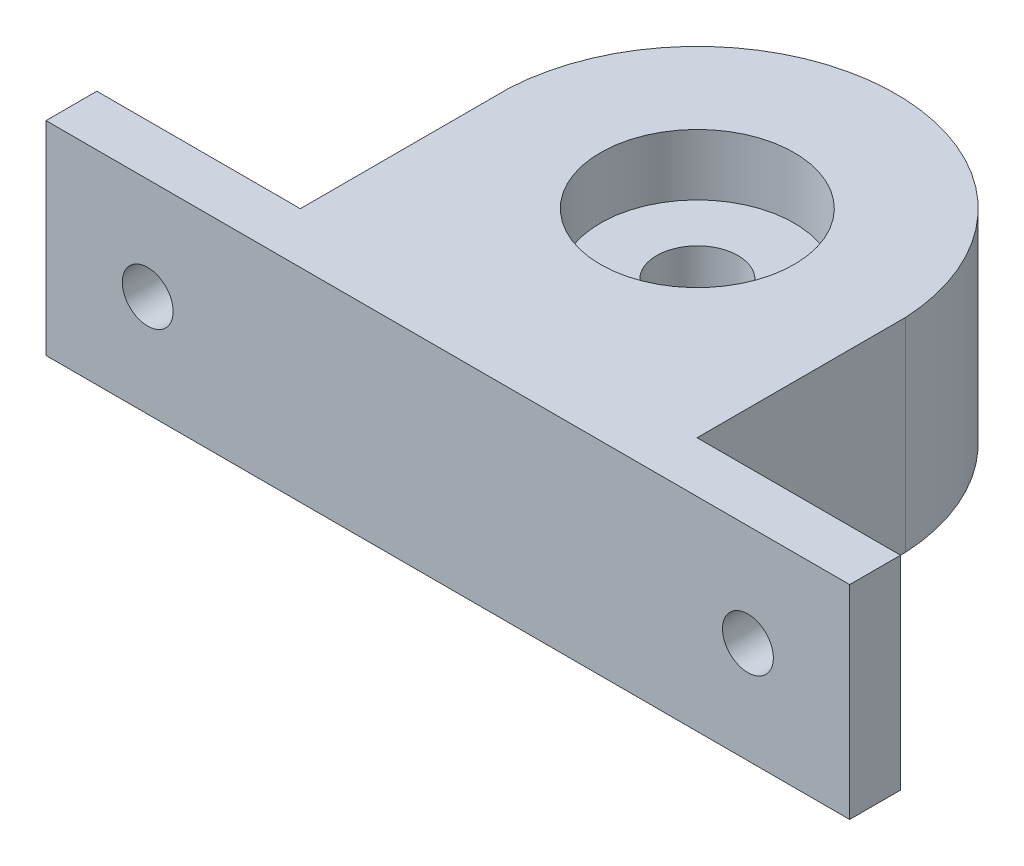
ISO-10303-21;
HEADER;
FILE_DESCRIPTION(('STEP AP214'),'2;1');
FILE_NAME('part.step','',(''),(''),'','','');
FILE_SCHEMA(('AUTOMOTIVE_DESIGN { 1 0 10303 214 1 1 1 1 }'));
ENDSEC;
DATA;
#1=APPLICATION_CONTEXT('core data for automotive mechanical design processes');
#2=APPLICATION_PROTOCOL_DEFINITION('international standard','automotive_design',2000,#1);
#3=PRODUCT_CONTEXT('',#1,'mechanical');
#4=PRODUCT('Part','Part','',(#3));
#5=PRODUCT_RELATED_PRODUCT_CATEGORY('part','',(#4));
#6=PRODUCT_DEFINITION_FORMATION('','',#4);
#7=PRODUCT_DEFINITION_CONTEXT('part definition',#1,'design');
#8=PRODUCT_DEFINITION('design','',#6,#7);
#9=PRODUCT_DEFINITION_SHAPE('','',#8);
#10=(LENGTH_UNIT() NAMED_UNIT(*) SI_UNIT(.MILLI.,.METRE.));
#11=(NAMED_UNIT(*) PLANE_ANGLE_UNIT() SI_UNIT($,.RADIAN.));
#12=(NAMED_UNIT(*) SI_UNIT($,.STERADIAN.) SOLID_ANGLE_UNIT());
#13=UNCERTAINTY_MEASURE_WITH_UNIT(LENGTH_MEASURE(1.E-05),#10,'distance_accuracy_value','');
#14=(GEOMETRIC_REPRESENTATION_CONTEXT(3) GLOBAL_UNCERTAINTY_ASSIGNED_CONTEXT((#13)) GLOBAL_UNIT_ASSIGNED_CONTEXT((#10,
#11,#12)) REPRESENTATION_CONTEXT('',''));
#15=CARTESIAN_POINT('',(0.,0.,0.));
#16=DIRECTION('',(0.,0.,1.));
#17=DIRECTION('',(1.,0.,0.));
#18=AXIS2_PLACEMENT_3D('',#15,#16,#17);
#19=CARTESIAN_POINT('',(16.5,-20.,0.));
#20=DIRECTION('',(-1.,0.,0.));
#21=DIRECTION('',(0.,0.,1.));
#22=AXIS2_PLACEMENT_3D('',#19,#20,#21);
#23=PLANE('',#22);
#24=DIRECTION('',(0.,0.,1.));
#25=VECTOR('',#24,1.);
#26=CARTESIAN_POINT('',(16.5,0.,0.));
#27=LINE('',#26,#25);
#28=CARTESIAN_POINT('',(16.5,0.,-23.0127373132569));
#29=VERTEX_POINT('',#28);
#30=CARTESIAN_POINT('',(16.5,0.,-2.5));
#31=VERTEX_POINT('',#30);
#32=EDGE_CURVE('E151',#29,#31,#27,.T.);
#33=ORIENTED_EDGE('',*,*,#32,.T.);
#34=DIRECTION('',(0.,1.,0.));
#35=VECTOR('',#34,1.);
#36=CARTESIAN_POINT('',(16.5,-20.,-2.5));
#37=LINE('',#36,#35);
#38=CARTESIAN_POINT('',(16.5,-20.,-2.5));
#39=VERTEX_POINT('',#38);
#40=EDGE_CURVE('E12',#39,#31,#37,.T.);
#41=ORIENTED_EDGE('',*,*,#40,.F.);
#42=DIRECTION('',(0.,0.,1.));
#43=VECTOR('',#42,1.);
#44=CARTESIAN_POINT('',(16.5,-20.,0.));
#45=LINE('',#44,#43);
#46=CARTESIAN_POINT('',(16.5,-20.,-23.0127373132569));
#47=VERTEX_POINT('',#46);
#48=EDGE_CURVE('E177',#47,#39,#45,.T.);
#49=ORIENTED_EDGE('',*,*,#48,.F.);
#50=DIRECTION('',(0.,1.,0.));
#51=VECTOR('',#50,1.);
#52=CARTESIAN_POINT('',(16.5,-20.,-23.0127373132569));
#53=LINE('',#52,#51);
#54=EDGE_CURVE('E47',#47,#29,#53,.T.);
#55=ORIENTED_EDGE('',*,*,#54,.T.);
#56=EDGE_LOOP('',(#33,#41,#49,#55));
#57=FACE_BOUND('',#56,.T.);
#58=ADVANCED_FACE('F43',(#57),#23,.F.);
#59=CARTESIAN_POINT('',(0.,-20.,-2.5));
#60=DIRECTION('',(0.,0.,1.));
#61=DIRECTION('',(1.,0.,0.));
#62=AXIS2_PLACEMENT_3D('',#59,#60,#61);
#63=PLANE('',#62);
#64=CARTESIAN_POINT('',(26.5,-10.,-2.5));
#65=DIRECTION('',(0.,0.,-1.));
#66=DIRECTION('',(-1.,0.,0.));
#67=AXIS2_PLACEMENT_3D('',#64,#65,#66);
#68=CIRCLE('',#67,2.5);
#69=CARTESIAN_POINT('',(24.,-10.,-2.5));
#70=VERTEX_POINT('',#69);
#71=EDGE_CURVE('E258',#70,#70,#68,.T.);
#72=ORIENTED_EDGE('',*,*,#71,.F.);
#73=EDGE_LOOP('',(#72));
#74=FACE_BOUND('',#73,.T.);
#75=DIRECTION('',(1.,0.,0.));
#76=VECTOR('',#75,1.);
#77=CARTESIAN_POINT('',(0.,0.,-2.5));
#78=LINE('',#77,#76);
#79=CARTESIAN_POINT('',(36.5,0.,-2.5));
#80=VERTEX_POINT('',#79);
#81=EDGE_CURVE('E96',#31,#80,#78,.T.);
#82=ORIENTED_EDGE('',*,*,#81,.T.);
#83=DIRECTION('',(0.,1.,0.));
#84=VECTOR('',#83,1.);
#85=CARTESIAN_POINT('',(36.5,-20.,-2.5));
#86=LINE('',#85,#84);
#87=CARTESIAN_POINT('',(36.5,-20.,-2.5));
#88=VERTEX_POINT('',#87);
#89=EDGE_CURVE('E54',#88,#80,#86,.T.);
#90=ORIENTED_EDGE('',*,*,#89,.F.);
#91=DIRECTION('',(1.,0.,0.));
#92=VECTOR('',#91,1.);
#93=CARTESIAN_POINT('',(0.,-20.,-2.5));
#94=LINE('',#93,#92);
#95=EDGE_CURVE('E62',#39,#88,#94,.T.);
#96=ORIENTED_EDGE('',*,*,#95,.F.);
#97=ORIENTED_EDGE('',*,*,#40,.T.);
#98=EDGE_LOOP('',(#82,#90,#96,#97));
#99=FACE_BOUND('',#98,.T.);
#100=ADVANCED_FACE('F209',(#74,#99),#63,.F.);
#101=CARTESIAN_POINT('',(36.5,-20.,0.));
#102=DIRECTION('',(1.,0.,0.));
#103=DIRECTION('',(0.,0.,-1.));
#104=AXIS2_PLACEMENT_3D('',#101,#102,#103);
#105=PLANE('',#104);
#106=DIRECTION('',(0.,0.,-1.));
#107=VECTOR('',#106,1.);
#108=CARTESIAN_POINT('',(36.5,0.,0.));
#109=LINE('',#108,#107);
#110=CARTESIAN_POINT('',(36.5,0.,2.5));
#111=VERTEX_POINT('',#110);
#112=EDGE_CURVE('E120',#111,#80,#109,.T.);
#113=ORIENTED_EDGE('',*,*,#112,.F.);
#114=DIRECTION('',(0.,1.,0.));
#115=VECTOR('',#114,1.);
#116=CARTESIAN_POINT('',(36.5,-20.,2.5));
#117=LINE('',#116,#115);
#118=CARTESIAN_POINT('',(36.5,-20.,2.5));
#119=VERTEX_POINT('',#118);
#120=EDGE_CURVE('E116',#119,#111,#117,.T.);
#121=ORIENTED_EDGE('',*,*,#120,.F.);
#122=DIRECTION('',(0.,0.,-1.));
#123=VECTOR('',#122,1.);
#124=CARTESIAN_POINT('',(36.5,-20.,0.));
#125=LINE('',#124,#123);
#126=EDGE_CURVE('E119',#119,#88,#125,.T.);
#127=ORIENTED_EDGE('',*,*,#126,.T.);
#128=ORIENTED_EDGE('',*,*,#89,.T.);
#129=EDGE_LOOP('',(#113,#121,#127,#128));
#130=FACE_BOUND('',#129,.T.);
#131=ADVANCED_FACE('F118',(#130),#105,.T.);
#132=CARTESIAN_POINT('',(0.,-20.,2.5));
#133=DIRECTION('',(0.,0.,1.));
#134=DIRECTION('',(1.,0.,0.));
#135=AXIS2_PLACEMENT_3D('',#132,#133,#134);
#136=PLANE('',#135);
#137=CARTESIAN_POINT('',(26.5,-10.,2.5));
#138=DIRECTION('',(0.,0.,1.));
#139=DIRECTION('',(1.,0.,0.));
#140=AXIS2_PLACEMENT_3D('',#137,#138,#139);
#141=CIRCLE('',#140,2.5);
#142=CARTESIAN_POINT('',(29.,-10.,2.5));
#143=VERTEX_POINT('',#142);
#144=EDGE_CURVE('E152',#143,#143,#141,.F.);
#145=ORIENTED_EDGE('',*,*,#144,.T.);
#146=EDGE_LOOP('',(#145));
#147=FACE_BOUND('',#146,.T.);
#148=CARTESIAN_POINT('',(-32.5,-10.,2.5));
#149=DIRECTION('',(0.,0.,1.));
#150=DIRECTION('',(1.,0.,0.));
#151=AXIS2_PLACEMENT_3D('',#148,#149,#150);
#152=CIRCLE('',#151,2.5);
#153=CARTESIAN_POINT('',(-30.,-10.,2.5));
#154=VERTEX_POINT('',#153);
#155=EDGE_CURVE('E254',#154,#154,#152,.F.);
#156=ORIENTED_EDGE('',*,*,#155,.T.);
#157=EDGE_LOOP('',(#156));
#158=FACE_BOUND('',#157,.T.);
#159=DIRECTION('',(1.,0.,0.));
#160=VECTOR('',#159,1.);
#161=CARTESIAN_POINT('',(0.,0.,2.5));
#162=LINE('',#161,#160);
#163=CARTESIAN_POINT('',(-42.5,0.,2.5));
#164=VERTEX_POINT('',#163);
#165=EDGE_CURVE('E171',#164,#111,#162,.T.);
#166=ORIENTED_EDGE('',*,*,#165,.F.);
#167=DIRECTION('',(0.,1.,0.));
#168=VECTOR('',#167,1.);
#169=CARTESIAN_POINT('',(-42.5,-20.,2.5));
#170=LINE('',#169,#168);
#171=CARTESIAN_POINT('',(-42.5,-20.,2.5));
#172=VERTEX_POINT('',#171);
#173=EDGE_CURVE('E126',#172,#164,#170,.T.);
#174=ORIENTED_EDGE('',*,*,#173,.F.);
#175=DIRECTION('',(1.,0.,0.));
#176=VECTOR('',#175,1.);
#177=CARTESIAN_POINT('',(0.,-20.,2.5));
#178=LINE('',#177,#176);
#179=EDGE_CURVE('E132',#172,#119,#178,.T.);
#180=ORIENTED_EDGE('',*,*,#179,.T.);
#181=ORIENTED_EDGE('',*,*,#120,.T.);
#182=EDGE_LOOP('',(#166,#174,#180,#181));
#183=FACE_BOUND('',#182,.T.);
#184=ADVANCED_FACE('F135',(#147,#158,#183),#136,.T.);
#185=CARTESIAN_POINT('',(-42.5,-20.,0.));
#186=DIRECTION('',(1.,0.,0.));
#187=DIRECTION('',(0.,0.,-1.));
#188=AXIS2_PLACEMENT_3D('',#185,#186,#187);
#189=PLANE('',#188);
#190=DIRECTION('',(0.,0.,-1.));
#191=VECTOR('',#190,1.);
#192=CARTESIAN_POINT('',(-42.5,0.,0.));
#193=LINE('',#192,#191);
#194=CARTESIAN_POINT('',(-42.5,0.,-2.5));
#195=VERTEX_POINT('',#194);
#196=EDGE_CURVE('E168',#164,#195,#193,.T.);
#197=ORIENTED_EDGE('',*,*,#196,.T.);
#198=DIRECTION('',(0.,1.,0.));
#199=VECTOR('',#198,1.);
#200=CARTESIAN_POINT('',(-42.5,-20.,-2.5));
#201=LINE('',#200,#199);
#202=CARTESIAN_POINT('',(-42.5,-20.,-2.5));
#203=VERTEX_POINT('',#202);
#204=EDGE_CURVE('E183',#203,#195,#201,.T.);
#205=ORIENTED_EDGE('',*,*,#204,.F.);
#206=DIRECTION('',(0.,0.,-1.));
#207=VECTOR('',#206,1.);
#208=CARTESIAN_POINT('',(-42.5,-20.,0.));
#209=LINE('',#208,#207);
#210=EDGE_CURVE('E138',#172,#203,#209,.T.);
#211=ORIENTED_EDGE('',*,*,#210,.F.);
#212=ORIENTED_EDGE('',*,*,#173,.T.);
#213=EDGE_LOOP('',(#197,#205,#211,#212));
#214=FACE_BOUND('',#213,.T.);
#215=ADVANCED_FACE('F224',(#214),#189,.F.);
#216=CARTESIAN_POINT('',(0.,-20.,-2.5));
#217=DIRECTION('',(0.,0.,1.));
#218=DIRECTION('',(1.,0.,0.));
#219=AXIS2_PLACEMENT_3D('',#216,#217,#218);
#220=PLANE('',#219);
#221=CARTESIAN_POINT('',(-32.5,-10.,-2.5));
#222=DIRECTION('',(0.,0.,-1.));
#223=DIRECTION('',(-1.,0.,0.));
#224=AXIS2_PLACEMENT_3D('',#221,#222,#223);
#225=CIRCLE('',#224,2.5);
#226=CARTESIAN_POINT('',(-35.,-10.,-2.5));
#227=VERTEX_POINT('',#226);
#228=EDGE_CURVE('E259',#227,#227,#225,.T.);
#229=ORIENTED_EDGE('',*,*,#228,.F.);
#230=EDGE_LOOP('',(#229));
#231=FACE_BOUND('',#230,.T.);
#232=DIRECTION('',(1.,0.,0.));
#233=VECTOR('',#232,1.);
#234=CARTESIAN_POINT('',(0.,0.,-2.5));
#235=LINE('',#234,#233);
#236=CARTESIAN_POINT('',(-22.5,0.,-2.5));
#237=VERTEX_POINT('',#236);
#238=EDGE_CURVE('E164',#195,#237,#235,.T.);
#239=ORIENTED_EDGE('',*,*,#238,.T.);
#240=DIRECTION('',(0.,1.,0.));
#241=VECTOR('',#240,1.);
#242=CARTESIAN_POINT('',(-22.5,-20.,-2.5));
#243=LINE('',#242,#241);
#244=CARTESIAN_POINT('',(-22.5,-20.,-2.5));
#245=VERTEX_POINT('',#244);
#246=EDGE_CURVE('E187',#245,#237,#243,.T.);
#247=ORIENTED_EDGE('',*,*,#246,.F.);
#248=DIRECTION('',(1.,0.,0.));
#249=VECTOR('',#248,1.);
#250=CARTESIAN_POINT('',(0.,-20.,-2.5));
#251=LINE('',#250,#249);
#252=EDGE_CURVE('E141',#203,#245,#251,.T.);
#253=ORIENTED_EDGE('',*,*,#252,.F.);
#254=ORIENTED_EDGE('',*,*,#204,.T.);
#255=EDGE_LOOP('',(#239,#247,#253,#254));
#256=FACE_BOUND('',#255,.T.);
#257=ADVANCED_FACE('F228',(#231,#256),#220,.F.);
#258=CARTESIAN_POINT('',(-22.5,-20.,0.));
#259=DIRECTION('',(-1.,0.,0.));
#260=DIRECTION('',(0.,0.,1.));
#261=AXIS2_PLACEMENT_3D('',#258,#259,#260);
#262=PLANE('',#261);
#263=DIRECTION('',(0.,0.,1.));
#264=VECTOR('',#263,1.);
#265=CARTESIAN_POINT('',(-22.5,0.,0.));
#266=LINE('',#265,#264);
#267=CARTESIAN_POINT('',(-22.5,0.,-23.0127373132569));
#268=VERTEX_POINT('',#267);
#269=EDGE_CURVE('E160',#268,#237,#266,.T.);
#270=ORIENTED_EDGE('',*,*,#269,.F.);
#271=DIRECTION('',(0.,1.,0.));
#272=VECTOR('',#271,1.);
#273=CARTESIAN_POINT('',(-22.5,-20.,-23.0127373132569));
#274=LINE('',#273,#272);
#275=CARTESIAN_POINT('',(-22.5,-20.,-23.0127373132569));
#276=VERTEX_POINT('',#275);
#277=EDGE_CURVE('E189',#276,#268,#274,.T.);
#278=ORIENTED_EDGE('',*,*,#277,.F.);
#279=DIRECTION('',(0.,0.,1.));
#280=VECTOR('',#279,1.);
#281=CARTESIAN_POINT('',(-22.5,-20.,0.));
#282=LINE('',#281,#280);
#283=EDGE_CURVE('E244',#276,#245,#282,.T.);
#284=ORIENTED_EDGE('',*,*,#283,.T.);
#285=ORIENTED_EDGE('',*,*,#246,.T.);
#286=EDGE_LOOP('',(#270,#278,#284,#285));
#287=FACE_BOUND('',#286,.T.);
#288=ADVANCED_FACE('F205',(#287),#262,.T.);
#289=CARTESIAN_POINT('',(-2.99999999999999,-20.,-22.025));
#290=DIRECTION('',(0.,1.,0.));
#291=DIRECTION('',(0.,0.,1.));
#292=AXIS2_PLACEMENT_3D('',#289,#290,#291);
#293=CYLINDRICAL_SURFACE('',#292,9.525);
#294=CARTESIAN_POINT('',(-2.99999999999999,-6.,-22.025));
#295=DIRECTION('',(0.,1.,0.));
#296=DIRECTION('',(0.,0.,1.));
#297=AXIS2_PLACEMENT_3D('',#294,#295,#296);
#298=CIRCLE('',#297,9.525);
#299=CARTESIAN_POINT('',(-2.99999999999999,-6.,-12.5));
#300=VERTEX_POINT('',#299);
#301=EDGE_CURVE('E270',#300,#300,#298,.F.);
#302=ORIENTED_EDGE('',*,*,#301,.T.);
#303=EDGE_LOOP('',(#302));
#304=FACE_BOUND('',#303,.T.);
#305=CARTESIAN_POINT('',(-2.99999999999999,0.,-22.025));
#306=DIRECTION('',(0.,1.,0.));
#307=DIRECTION('',(0.,0.,1.));
#308=AXIS2_PLACEMENT_3D('',#305,#306,#307);
#309=CIRCLE('',#308,9.525);
#310=CARTESIAN_POINT('',(-2.99999999999999,0.,-12.5));
#311=VERTEX_POINT('',#310);
#312=EDGE_CURVE('E147',#311,#311,#309,.T.);
#313=ORIENTED_EDGE('',*,*,#312,.T.);
#314=EDGE_LOOP('',(#313));
#315=FACE_BOUND('',#314,.T.);
#316=ADVANCED_FACE('F45',(#304,#315),#293,.F.);
#317=CARTESIAN_POINT('',(-2.99999999999999,-20.,-22.025));
#318=DIRECTION('',(0.,1.,0.));
#319=DIRECTION('',(0.,0.,1.));
#320=AXIS2_PLACEMENT_3D('',#317,#318,#319);
#321=CYLINDRICAL_SURFACE('',#320,19.525);
#322=CARTESIAN_POINT('',(-2.99999999999999,0.,-22.025));
#323=DIRECTION('',(0.,1.,0.));
#324=DIRECTION('',(0.,0.,1.));
#325=AXIS2_PLACEMENT_3D('',#322,#323,#324);
#326=CIRCLE('',#325,19.525);
#327=EDGE_CURVE('E156',#29,#268,#326,.T.);
#328=ORIENTED_EDGE('',*,*,#327,.F.);
#329=ORIENTED_EDGE('',*,*,#54,.F.);
#330=CARTESIAN_POINT('',(-2.99999999999999,-20.,-22.025));
#331=DIRECTION('',(0.,1.,0.));
#332=DIRECTION('',(0.,0.,1.));
#333=AXIS2_PLACEMENT_3D('',#330,#331,#332);
#334=CIRCLE('',#333,19.525);
#335=EDGE_CURVE('E247',#47,#276,#334,.T.);
#336=ORIENTED_EDGE('',*,*,#335,.T.);
#337=ORIENTED_EDGE('',*,*,#277,.T.);
#338=EDGE_LOOP('',(#328,#329,#336,#337));
#339=FACE_BOUND('',#338,.T.);
#340=ADVANCED_FACE('F197',(#339),#321,.T.);
#341=CARTESIAN_POINT('',(0.,-20.,0.));
#342=DIRECTION('',(0.,1.,0.));
#343=DIRECTION('',(0.,0.,1.));
#344=AXIS2_PLACEMENT_3D('',#341,#342,#343);
#345=PLANE('',#344);
#346=ORIENTED_EDGE('',*,*,#48,.T.);
#347=ORIENTED_EDGE('',*,*,#95,.T.);
#348=ORIENTED_EDGE('',*,*,#126,.F.);
#349=ORIENTED_EDGE('',*,*,#179,.F.);
#350=ORIENTED_EDGE('',*,*,#210,.T.);
#351=ORIENTED_EDGE('',*,*,#252,.T.);
#352=ORIENTED_EDGE('',*,*,#283,.F.);
#353=ORIENTED_EDGE('',*,*,#335,.F.);
#354=EDGE_LOOP('',(#346,#347,#348,#349,#350,#351,#352,#353));
#355=FACE_BOUND('',#354,.T.);
#356=CARTESIAN_POINT('',(-2.99999999999999,-20.,-22.025));
#357=DIRECTION('',(0.,-1.,0.));
#358=DIRECTION('',(0.,0.,-1.));
#359=AXIS2_PLACEMENT_3D('',#356,#357,#358);
#360=CIRCLE('',#359,4.);
#361=CARTESIAN_POINT('',(-2.99999999999999,-20.,-26.025));
#362=VERTEX_POINT('',#361);
#363=EDGE_CURVE('E274',#362,#362,#360,.T.);
#364=ORIENTED_EDGE('',*,*,#363,.F.);
#365=EDGE_LOOP('',(#364));
#366=FACE_BOUND('',#365,.T.);
#367=ADVANCED_FACE('F130',(#355,#366),#345,.F.);
#368=CARTESIAN_POINT('',(0.,0.,0.));
#369=DIRECTION('',(0.,1.,0.));
#370=DIRECTION('',(0.,0.,1.));
#371=AXIS2_PLACEMENT_3D('',#368,#369,#370);
#372=PLANE('',#371);
#373=ORIENTED_EDGE('',*,*,#312,.F.);
#374=EDGE_LOOP('',(#373));
#375=FACE_BOUND('',#374,.T.);
#376=ORIENTED_EDGE('',*,*,#32,.F.);
#377=ORIENTED_EDGE('',*,*,#327,.T.);
#378=ORIENTED_EDGE('',*,*,#269,.T.);
#379=ORIENTED_EDGE('',*,*,#238,.F.);
#380=ORIENTED_EDGE('',*,*,#196,.F.);
#381=ORIENTED_EDGE('',*,*,#165,.T.);
#382=ORIENTED_EDGE('',*,*,#112,.T.);
#383=ORIENTED_EDGE('',*,*,#81,.F.);
#384=EDGE_LOOP('',(#376,#377,#378,#379,#380,#381,#382,#383));
#385=FACE_BOUND('',#384,.T.);
#386=ADVANCED_FACE('F196',(#375,#385),#372,.T.);
#387=CARTESIAN_POINT('',(-32.5,-10.,9.57106781186548));
#388=DIRECTION('',(0.,0.,-1.));
#389=DIRECTION('',(-1.,0.,0.));
#390=AXIS2_PLACEMENT_3D('',#387,#388,#389);
#391=CYLINDRICAL_SURFACE('',#390,2.5);
#392=ORIENTED_EDGE('',*,*,#228,.T.);
#393=EDGE_LOOP('',(#392));
#394=FACE_BOUND('',#393,.T.);
#395=ORIENTED_EDGE('',*,*,#155,.F.);
#396=EDGE_LOOP('',(#395));
#397=FACE_BOUND('',#396,.T.);
#398=ADVANCED_FACE('F299',(#394,#397),#391,.F.);
#399=CARTESIAN_POINT('',(26.5,-10.,9.57106781186548));
#400=DIRECTION('',(0.,0.,-1.));
#401=DIRECTION('',(-1.,0.,0.));
#402=AXIS2_PLACEMENT_3D('',#399,#400,#401);
#403=CYLINDRICAL_SURFACE('',#402,2.5);
#404=ORIENTED_EDGE('',*,*,#71,.T.);
#405=EDGE_LOOP('',(#404));
#406=FACE_BOUND('',#405,.T.);
#407=ORIENTED_EDGE('',*,*,#144,.F.);
#408=EDGE_LOOP('',(#407));
#409=FACE_BOUND('',#408,.T.);
#410=ADVANCED_FACE('F286',(#406,#409),#403,.F.);
#411=CARTESIAN_POINT('',(-2.99999999999999,26.9407683632075,-22.025));
#412=DIRECTION('',(0.,-1.,0.));
#413=DIRECTION('',(0.,0.,-1.));
#414=AXIS2_PLACEMENT_3D('',#411,#412,#413);
#415=CYLINDRICAL_SURFACE('',#414,4.);
#416=CARTESIAN_POINT('',(-2.99999999999999,-6.,-22.025));
#417=DIRECTION('',(0.,1.,0.));
#418=DIRECTION('',(0.,0.,1.));
#419=AXIS2_PLACEMENT_3D('',#416,#417,#418);
#420=CIRCLE('',#419,4.);
#421=CARTESIAN_POINT('',(-2.99999999999999,-6.00000000000001,-26.025));
#422=VERTEX_POINT('',#421);
#423=EDGE_CURVE('E263',#422,#422,#420,.F.);
#424=CARTESIAN_POINT('',(-2.99999999999999,-20.,-26.025));
#425=CARTESIAN_POINT('',(-2.99999999999999,-19.8541666666667,-26.025));
#426=CARTESIAN_POINT('',(-2.99999999999999,-19.7083333333333,-26.025));
#427=CARTESIAN_POINT('',(-2.99999999999999,-19.4166666666667,-26.025));
#428=CARTESIAN_POINT('',(-2.99999999999999,-19.2708333333333,-26.025));
#429=CARTESIAN_POINT('',(-2.99999999999999,-18.9791666666667,-26.025));
#430=CARTESIAN_POINT('',(-2.99999999999999,-18.8333333333333,-26.025));
#431=CARTESIAN_POINT('',(-2.99999999999999,-18.5416666666667,-26.025));
#432=CARTESIAN_POINT('',(-2.99999999999999,-18.3958333333333,-26.025));
#433=CARTESIAN_POINT('',(-2.99999999999999,-18.1041666666667,-26.025));
#434=CARTESIAN_POINT('',(-2.99999999999999,-17.9583333333333,-26.025));
#435=CARTESIAN_POINT('',(-2.99999999999999,-17.6666666666667,-26.025));
#436=CARTESIAN_POINT('',(-2.99999999999999,-17.5208333333333,-26.025));
#437=CARTESIAN_POINT('',(-2.99999999999999,-17.2291666666667,-26.025));
#438=CARTESIAN_POINT('',(-2.99999999999999,-17.0833333333333,-26.025));
#439=CARTESIAN_POINT('',(-2.99999999999999,-16.7916666666667,-26.025));
#440=CARTESIAN_POINT('',(-2.99999999999999,-16.6458333333333,-26.025));
#441=CARTESIAN_POINT('',(-2.99999999999999,-16.3541666666667,-26.025));
#442=CARTESIAN_POINT('',(-2.99999999999999,-16.2083333333333,-26.025));
#443=CARTESIAN_POINT('',(-2.99999999999999,-15.9166666666667,-26.025));
#444=CARTESIAN_POINT('',(-2.99999999999999,-15.7708333333333,-26.025));
#445=CARTESIAN_POINT('',(-2.99999999999999,-15.4791666666667,-26.025));
#446=CARTESIAN_POINT('',(-2.99999999999999,-15.3333333333333,-26.025));
#447=CARTESIAN_POINT('',(-2.99999999999999,-15.0416666666667,-26.025));
#448=CARTESIAN_POINT('',(-2.99999999999999,-14.8958333333333,-26.025));
#449=CARTESIAN_POINT('',(-2.99999999999999,-14.6041666666667,-26.025));
#450=CARTESIAN_POINT('',(-2.99999999999999,-14.4583333333333,-26.025));
#451=CARTESIAN_POINT('',(-2.99999999999999,-14.1666666666667,-26.025));
#452=CARTESIAN_POINT('',(-2.99999999999999,-14.0208333333333,-26.025));
#453=CARTESIAN_POINT('',(-2.99999999999999,-13.7291666666667,-26.025));
#454=CARTESIAN_POINT('',(-2.99999999999999,-13.5833333333333,-26.025));
#455=CARTESIAN_POINT('',(-2.99999999999999,-13.2916666666667,-26.025));
#456=CARTESIAN_POINT('',(-2.99999999999999,-13.1458333333333,-26.025));
#457=CARTESIAN_POINT('',(-2.99999999999999,-12.8541666666667,-26.025));
#458=CARTESIAN_POINT('',(-2.99999999999999,-12.7083333333333,-26.025));
#459=CARTESIAN_POINT('',(-2.99999999999999,-12.4166666666667,-26.025));
#460=CARTESIAN_POINT('',(-2.99999999999999,-12.2708333333333,-26.025));
#461=CARTESIAN_POINT('',(-2.99999999999999,-11.9791666666667,-26.025));
#462=CARTESIAN_POINT('',(-2.99999999999999,-11.8333333333333,-26.025));
#463=CARTESIAN_POINT('',(-2.99999999999999,-11.5416666666667,-26.025));
#464=CARTESIAN_POINT('',(-2.99999999999999,-11.3958333333333,-26.025));
#465=CARTESIAN_POINT('',(-2.99999999999999,-11.1041666666667,-26.025));
#466=CARTESIAN_POINT('',(-2.99999999999999,-10.9583333333333,-26.025));
#467=CARTESIAN_POINT('',(-2.99999999999999,-10.6666666666667,-26.025));
#468=CARTESIAN_POINT('',(-2.99999999999999,-10.5208333333333,-26.025));
#469=CARTESIAN_POINT('',(-2.99999999999999,-10.2291666666667,-26.025));
#470=CARTESIAN_POINT('',(-2.99999999999999,-10.0833333333333,-26.025));
#471=CARTESIAN_POINT('',(-2.99999999999999,-9.79166666666667,-26.025));
#472=CARTESIAN_POINT('',(-2.99999999999999,-9.64583333333334,-26.025));
#473=CARTESIAN_POINT('',(-2.99999999999999,-9.35416666666667,-26.025));
#474=CARTESIAN_POINT('',(-2.99999999999999,-9.20833333333334,-26.025));
#475=CARTESIAN_POINT('',(-2.99999999999999,-8.91666666666667,-26.025));
#476=CARTESIAN_POINT('',(-2.99999999999999,-8.77083333333334,-26.025));
#477=CARTESIAN_POINT('',(-2.99999999999999,-8.47916666666667,-26.025));
#478=CARTESIAN_POINT('',(-2.99999999999999,-8.33333333333334,-26.025));
#479=CARTESIAN_POINT('',(-2.99999999999999,-8.04166666666667,-26.025));
#480=CARTESIAN_POINT('',(-2.99999999999999,-7.89583333333334,-26.025));
#481=CARTESIAN_POINT('',(-2.99999999999999,-7.60416666666667,-26.025));
#482=CARTESIAN_POINT('',(-2.99999999999999,-7.45833333333334,-26.025));
#483=CARTESIAN_POINT('',(-2.99999999999999,-7.16666666666667,-26.025));
#484=CARTESIAN_POINT('',(-2.99999999999999,-7.02083333333334,-26.025));
#485=CARTESIAN_POINT('',(-2.99999999999999,-6.72916666666668,-26.025));
#486=CARTESIAN_POINT('',(-2.99999999999999,-6.58333333333334,-26.025));
#487=CARTESIAN_POINT('',(-2.99999999999999,-6.29166666666668,-26.025));
#488=CARTESIAN_POINT('',(-2.99999999999999,-6.14583333333334,-26.025));
#489=CARTESIAN_POINT('',(-2.99999999999999,-6.00000000000001,-26.025));
#490=B_SPLINE_CURVE_WITH_KNOTS('',3,(#424,#425,#426,#427,#428,#429,#430,#431,#432,#433,#434,
#435,#436,#437,#438,#439,#440,#441,#442,#443,#444,#445,#446,#447,#448,#449,#450,#451,#452,#453,
#454,#455,#456,#457,#458,#459,#460,#461,#462,#463,#464,#465,#466,#467,#468,#469,#470,#471,#472,
#473,#474,#475,#476,#477,#478,#479,#480,#481,#482,#483,#484,#485,#486,#487,#488,#489),
.UNSPECIFIED.,.F.,.F.,(4,2,2,2,2,2,2,2,2,2,2,2,2,2,2,2,2,2,2,2,2,2,2,2,2,2,2,2,2,2,2,2,4),(0.,
0.4375,0.875000000000001,1.3125,1.75,2.1875,2.625,3.0625,3.5,3.9375,4.375,4.8125,
5.24999999999999,5.68749999999999,6.12499999999999,6.56249999999999,6.99999999999999,
7.43749999999999,7.87499999999999,8.31249999999999,8.74999999999999,9.18749999999999,
9.62499999999999,10.0625,10.5,10.9375,11.375,11.8125,12.25,12.6875,13.125,13.5625,14.),.UNSPECIFIED.);
#491=EDGE_CURVE('BSEAM282',#362,#422,#490,.T.);
#492=ORIENTED_EDGE('',*,*,#363,.T.);
#493=ORIENTED_EDGE('',*,*,#423,.F.);
#494=ORIENTED_EDGE('',*,*,#491,.T.);
#495=ORIENTED_EDGE('',*,*,#491,.F.);
#496=EDGE_LOOP('',(#492,#494,#493,#495));
#497=FACE_BOUND('',#496,.T.);
#498=ADVANCED_FACE('F282',(#497),#415,.F.);
#499=CARTESIAN_POINT('',(0.,-6.,0.));
#500=DIRECTION('',(0.,1.,0.));
#501=DIRECTION('',(0.,0.,1.));
#502=AXIS2_PLACEMENT_3D('',#499,#500,#501);
#503=PLANE('',#502);
#504=ORIENTED_EDGE('',*,*,#301,.F.);
#505=EDGE_LOOP('',(#504));
#506=FACE_BOUND('',#505,.T.);
#507=ORIENTED_EDGE('',*,*,#423,.T.);
#508=EDGE_LOOP('',(#507));
#509=FACE_BOUND('',#508,.T.);
#510=ADVANCED_FACE('F285',(#506,#509),#503,.T.);
#511=CLOSED_SHELL('',(#58,#100,#131,#184,#215,#257,#288,#316,#340,#367,#386,#398,#410,#498,#510));
#512=MANIFOLD_SOLID_BREP('B2',#511);
#513=ADVANCED_BREP_SHAPE_REPRESENTATION('',(#18,#512),#14);
#514=SHAPE_DEFINITION_REPRESENTATION(#9,#513);
ENDSEC;
END-ISO-10303-21;
